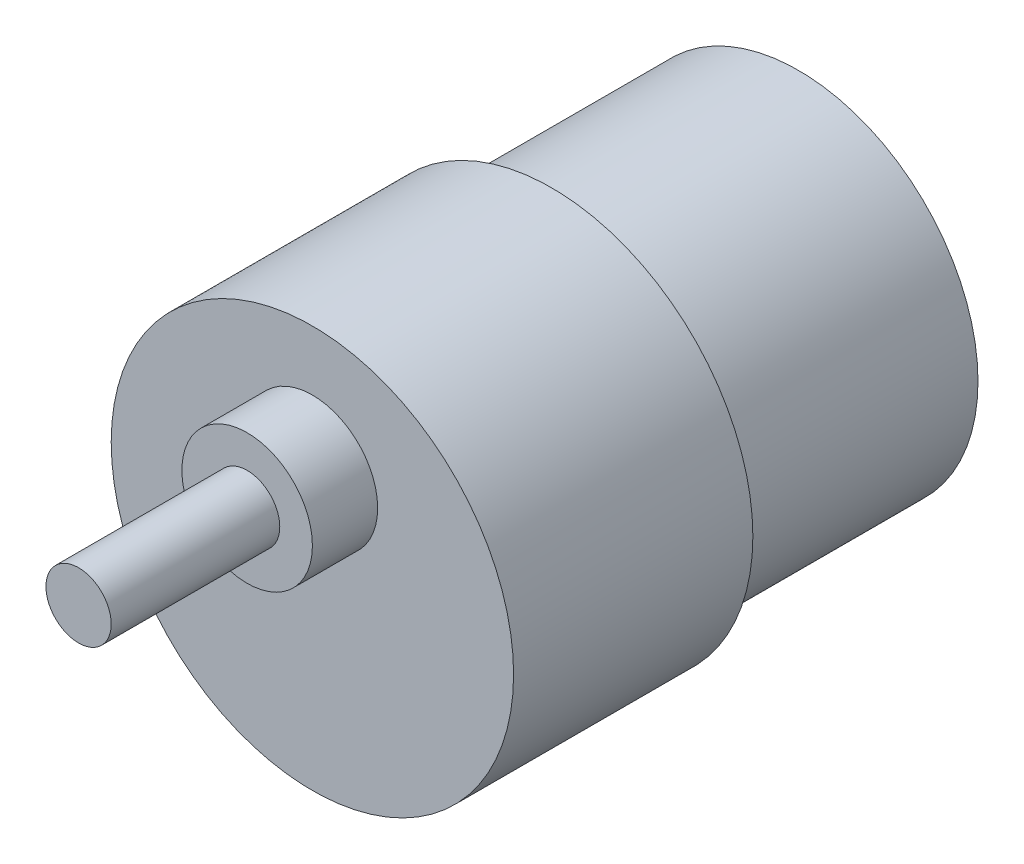
ISO-10303-21;
HEADER;
FILE_DESCRIPTION(('STEP AP214'),'2;1');
FILE_NAME('part.step','',(''),(''),'','','');
FILE_SCHEMA(('AUTOMOTIVE_DESIGN { 1 0 10303 214 1 1 1 1 }'));
ENDSEC;
DATA;
#1=APPLICATION_CONTEXT('core data for automotive mechanical design processes');
#2=APPLICATION_PROTOCOL_DEFINITION('international standard','automotive_design',2000,#1);
#3=PRODUCT_CONTEXT('',#1,'mechanical');
#4=PRODUCT('Part','Part','',(#3));
#5=PRODUCT_RELATED_PRODUCT_CATEGORY('part','',(#4));
#6=PRODUCT_DEFINITION_FORMATION('','',#4);
#7=PRODUCT_DEFINITION_CONTEXT('part definition',#1,'design');
#8=PRODUCT_DEFINITION('design','',#6,#7);
#9=PRODUCT_DEFINITION_SHAPE('','',#8);
#10=(LENGTH_UNIT() NAMED_UNIT(*) SI_UNIT(.MILLI.,.METRE.));
#11=(NAMED_UNIT(*) PLANE_ANGLE_UNIT() SI_UNIT($,.RADIAN.));
#12=(NAMED_UNIT(*) SI_UNIT($,.STERADIAN.) SOLID_ANGLE_UNIT());
#13=UNCERTAINTY_MEASURE_WITH_UNIT(LENGTH_MEASURE(1.E-05),#10,'distance_accuracy_value','');
#14=(GEOMETRIC_REPRESENTATION_CONTEXT(3) GLOBAL_UNCERTAINTY_ASSIGNED_CONTEXT((#13)) GLOBAL_UNIT_ASSIGNED_CONTEXT((#10,
#11,#12)) REPRESENTATION_CONTEXT('',''));
#15=CARTESIAN_POINT('',(0.,0.,0.));
#16=DIRECTION('',(0.,0.,1.));
#17=DIRECTION('',(1.,0.,0.));
#18=AXIS2_PLACEMENT_3D('',#15,#16,#17);
#19=CARTESIAN_POINT('',(0.,0.,22.));
#20=DIRECTION('',(0.,0.,-1.));
#21=DIRECTION('',(-1.,0.,0.));
#22=AXIS2_PLACEMENT_3D('',#19,#20,#21);
#23=CYLINDRICAL_SURFACE('',#22,18.5);
#24=CARTESIAN_POINT('',(0.,0.,22.));
#25=DIRECTION('',(0.,0.,1.));
#26=DIRECTION('',(1.,0.,0.));
#27=AXIS2_PLACEMENT_3D('',#24,#25,#26);
#28=CIRCLE('',#27,18.5);
#29=CARTESIAN_POINT('',(18.5,0.,22.));
#30=VERTEX_POINT('',#29);
#31=EDGE_CURVE('E51',#30,#30,#28,.T.);
#32=ORIENTED_EDGE('',*,*,#31,.F.);
#33=EDGE_LOOP('',(#32));
#34=FACE_BOUND('',#33,.T.);
#35=CARTESIAN_POINT('',(0.,0.,0.));
#36=DIRECTION('',(0.,0.,1.));
#37=DIRECTION('',(1.,0.,0.));
#38=AXIS2_PLACEMENT_3D('',#35,#36,#37);
#39=CIRCLE('',#38,18.5);
#40=CARTESIAN_POINT('',(18.5,0.,0.));
#41=VERTEX_POINT('',#40);
#42=EDGE_CURVE('E40',#41,#41,#39,.T.);
#43=ORIENTED_EDGE('',*,*,#42,.T.);
#44=EDGE_LOOP('',(#43));
#45=FACE_BOUND('',#44,.T.);
#46=ADVANCED_FACE('F37',(#34,#45),#23,.T.);
#47=CARTESIAN_POINT('',(0.,0.,22.));
#48=DIRECTION('',(0.,0.,1.));
#49=DIRECTION('',(1.,0.,0.));
#50=AXIS2_PLACEMENT_3D('',#47,#48,#49);
#51=PLANE('',#50);
#52=CARTESIAN_POINT('',(0.,7.,22.));
#53=DIRECTION('',(0.,0.,1.));
#54=DIRECTION('',(1.,0.,0.));
#55=AXIS2_PLACEMENT_3D('',#52,#53,#54);
#56=CIRCLE('',#55,6.);
#57=CARTESIAN_POINT('',(6.,7.,22.));
#58=VERTEX_POINT('',#57);
#59=EDGE_CURVE('E59',#58,#58,#56,.T.);
#60=ORIENTED_EDGE('',*,*,#59,.F.);
#61=EDGE_LOOP('',(#60));
#62=FACE_BOUND('',#61,.T.);
#63=ORIENTED_EDGE('',*,*,#31,.T.);
#64=EDGE_LOOP('',(#63));
#65=FACE_BOUND('',#64,.T.);
#66=ADVANCED_FACE('F79',(#62,#65),#51,.T.);
#67=CARTESIAN_POINT('',(0.,0.,0.));
#68=DIRECTION('',(0.,0.,1.));
#69=DIRECTION('',(1.,0.,0.));
#70=AXIS2_PLACEMENT_3D('',#67,#68,#69);
#71=PLANE('',#70);
#72=CARTESIAN_POINT('',(0.,0.,0.));
#73=DIRECTION('',(0.,0.,-1.));
#74=DIRECTION('',(-1.,0.,0.));
#75=AXIS2_PLACEMENT_3D('',#72,#73,#74);
#76=CIRCLE('',#75,16.5);
#77=CARTESIAN_POINT('',(-16.5,0.,0.));
#78=VERTEX_POINT('',#77);
#79=EDGE_CURVE('E10',#78,#78,#76,.T.);
#80=ORIENTED_EDGE('',*,*,#79,.F.);
#81=EDGE_LOOP('',(#80));
#82=FACE_BOUND('',#81,.T.);
#83=ORIENTED_EDGE('',*,*,#42,.F.);
#84=EDGE_LOOP('',(#83));
#85=FACE_BOUND('',#84,.T.);
#86=ADVANCED_FACE('F76',(#82,#85),#71,.F.);
#87=CARTESIAN_POINT('',(0.,7.,28.));
#88=DIRECTION('',(0.,0.,-1.));
#89=DIRECTION('',(-1.,0.,0.));
#90=AXIS2_PLACEMENT_3D('',#87,#88,#89);
#91=CYLINDRICAL_SURFACE('',#90,6.);
#92=CARTESIAN_POINT('',(0.,7.,28.));
#93=DIRECTION('',(0.,0.,1.));
#94=DIRECTION('',(1.,0.,0.));
#95=AXIS2_PLACEMENT_3D('',#92,#93,#94);
#96=CIRCLE('',#95,6.);
#97=CARTESIAN_POINT('',(6.,7.,28.));
#98=VERTEX_POINT('',#97);
#99=EDGE_CURVE('E61',#98,#98,#96,.T.);
#100=ORIENTED_EDGE('',*,*,#99,.F.);
#101=EDGE_LOOP('',(#100));
#102=FACE_BOUND('',#101,.T.);
#103=ORIENTED_EDGE('',*,*,#59,.T.);
#104=EDGE_LOOP('',(#103));
#105=FACE_BOUND('',#104,.T.);
#106=ADVANCED_FACE('F78',(#102,#105),#91,.T.);
#107=CARTESIAN_POINT('',(0.,7.,28.));
#108=DIRECTION('',(0.,0.,1.));
#109=DIRECTION('',(1.,0.,0.));
#110=AXIS2_PLACEMENT_3D('',#107,#108,#109);
#111=PLANE('',#110);
#112=CARTESIAN_POINT('',(0.,7.,28.));
#113=DIRECTION('',(0.,0.,1.));
#114=DIRECTION('',(1.,0.,0.));
#115=AXIS2_PLACEMENT_3D('',#112,#113,#114);
#116=CIRCLE('',#115,3.);
#117=CARTESIAN_POINT('',(3.,7.,28.));
#118=VERTEX_POINT('',#117);
#119=EDGE_CURVE('E45',#118,#118,#116,.T.);
#120=ORIENTED_EDGE('',*,*,#119,.F.);
#121=EDGE_LOOP('',(#120));
#122=FACE_BOUND('',#121,.T.);
#123=ORIENTED_EDGE('',*,*,#99,.T.);
#124=EDGE_LOOP('',(#123));
#125=FACE_BOUND('',#124,.T.);
#126=ADVANCED_FACE('F85',(#122,#125),#111,.T.);
#127=CARTESIAN_POINT('',(0.,7.,43.5));
#128=DIRECTION('',(0.,0.,-1.));
#129=DIRECTION('',(-1.,0.,0.));
#130=AXIS2_PLACEMENT_3D('',#127,#128,#129);
#131=CYLINDRICAL_SURFACE('',#130,3.);
#132=CARTESIAN_POINT('',(0.,7.,43.5));
#133=DIRECTION('',(0.,0.,1.));
#134=DIRECTION('',(1.,0.,0.));
#135=AXIS2_PLACEMENT_3D('',#132,#133,#134);
#136=CIRCLE('',#135,3.);
#137=CARTESIAN_POINT('',(3.,7.,43.5));
#138=VERTEX_POINT('',#137);
#139=EDGE_CURVE('E56',#138,#138,#136,.T.);
#140=ORIENTED_EDGE('',*,*,#139,.F.);
#141=EDGE_LOOP('',(#140));
#142=FACE_BOUND('',#141,.T.);
#143=ORIENTED_EDGE('',*,*,#119,.T.);
#144=EDGE_LOOP('',(#143));
#145=FACE_BOUND('',#144,.T.);
#146=ADVANCED_FACE('F114',(#142,#145),#131,.T.);
#147=CARTESIAN_POINT('',(0.,7.,43.5));
#148=DIRECTION('',(0.,0.,1.));
#149=DIRECTION('',(1.,0.,0.));
#150=AXIS2_PLACEMENT_3D('',#147,#148,#149);
#151=PLANE('',#150);
#152=ORIENTED_EDGE('',*,*,#139,.T.);
#153=EDGE_LOOP('',(#152));
#154=FACE_BOUND('',#153,.T.);
#155=ADVANCED_FACE('F124',(#154),#151,.T.);
#156=CARTESIAN_POINT('',(0.,0.,-22.7));
#157=DIRECTION('',(0.,0.,1.));
#158=DIRECTION('',(1.,0.,0.));
#159=AXIS2_PLACEMENT_3D('',#156,#157,#158);
#160=CYLINDRICAL_SURFACE('',#159,16.5);
#161=CARTESIAN_POINT('',(0.,0.,-22.7));
#162=DIRECTION('',(0.,0.,-1.));
#163=DIRECTION('',(-1.,0.,0.));
#164=AXIS2_PLACEMENT_3D('',#161,#162,#163);
#165=CIRCLE('',#164,16.5);
#166=CARTESIAN_POINT('',(-16.5,0.,-22.7));
#167=VERTEX_POINT('',#166);
#168=EDGE_CURVE('E55',#167,#167,#165,.T.);
#169=ORIENTED_EDGE('',*,*,#168,.F.);
#170=EDGE_LOOP('',(#169));
#171=FACE_BOUND('',#170,.T.);
#172=ORIENTED_EDGE('',*,*,#79,.T.);
#173=EDGE_LOOP('',(#172));
#174=FACE_BOUND('',#173,.T.);
#175=ADVANCED_FACE('F133',(#171,#174),#160,.T.);
#176=CARTESIAN_POINT('',(0.,0.,-22.7));
#177=DIRECTION('',(0.,0.,-1.));
#178=DIRECTION('',(-1.,0.,0.));
#179=AXIS2_PLACEMENT_3D('',#176,#177,#178);
#180=PLANE('',#179);
#181=ORIENTED_EDGE('',*,*,#168,.T.);
#182=EDGE_LOOP('',(#181));
#183=FACE_BOUND('',#182,.T.);
#184=ADVANCED_FACE('F147',(#183),#180,.T.);
#185=CLOSED_SHELL('',(#46,#66,#86,#106,#126,#146,#155,#175,#184));
#186=MANIFOLD_SOLID_BREP('B2',#185);
#187=ADVANCED_BREP_SHAPE_REPRESENTATION('',(#18,#186),#14);
#188=SHAPE_DEFINITION_REPRESENTATION(#9,#187);
ENDSEC;
END-ISO-10303-21;
